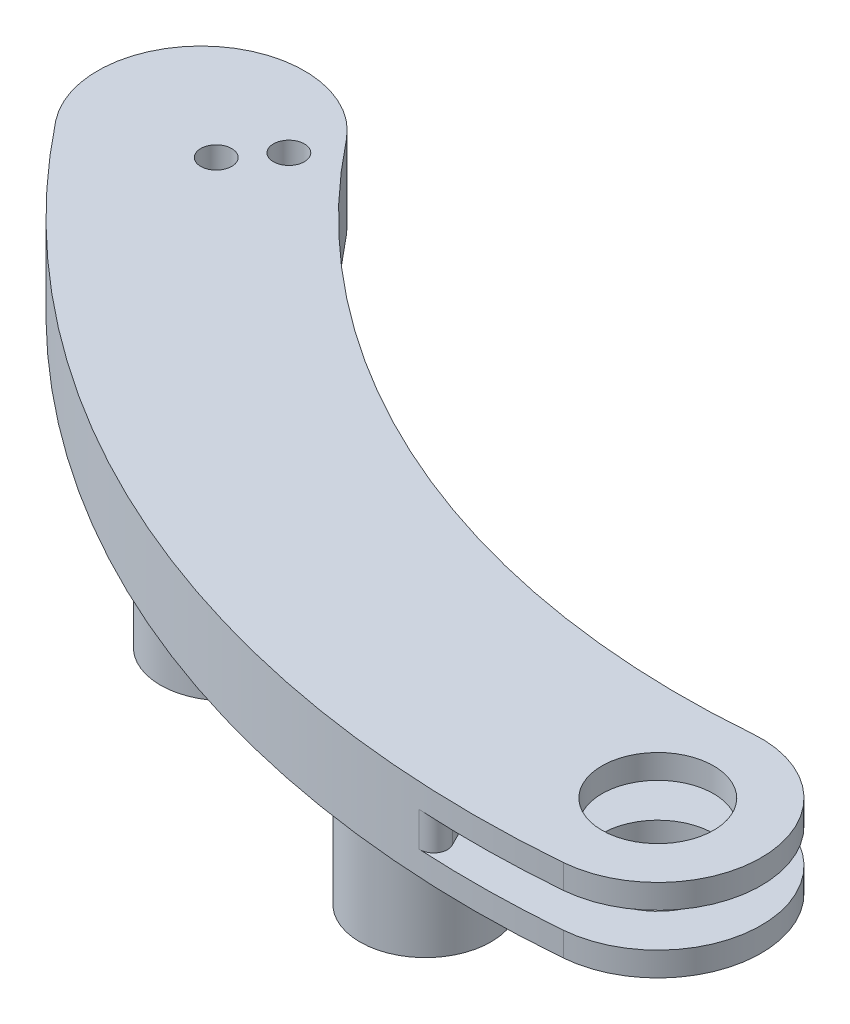
ISO-10303-21;
HEADER;
FILE_DESCRIPTION(('STEP AP214'),'2;1');
FILE_NAME('part.step','',(''),(''),'','','');
FILE_SCHEMA(('AUTOMOTIVE_DESIGN { 1 0 10303 214 1 1 1 1 }'));
ENDSEC;
DATA;
#1=APPLICATION_CONTEXT('core data for automotive mechanical design processes');
#2=APPLICATION_PROTOCOL_DEFINITION('international standard','automotive_design',2000,#1);
#3=PRODUCT_CONTEXT('',#1,'mechanical');
#4=PRODUCT('Part','Part','',(#3));
#5=PRODUCT_RELATED_PRODUCT_CATEGORY('part','',(#4));
#6=PRODUCT_DEFINITION_FORMATION('','',#4);
#7=PRODUCT_DEFINITION_CONTEXT('part definition',#1,'design');
#8=PRODUCT_DEFINITION('design','',#6,#7);
#9=PRODUCT_DEFINITION_SHAPE('','',#8);
#10=(LENGTH_UNIT() NAMED_UNIT(*) SI_UNIT(.MILLI.,.METRE.));
#11=(NAMED_UNIT(*) PLANE_ANGLE_UNIT() SI_UNIT($,.RADIAN.));
#12=(NAMED_UNIT(*) SI_UNIT($,.STERADIAN.) SOLID_ANGLE_UNIT());
#13=UNCERTAINTY_MEASURE_WITH_UNIT(LENGTH_MEASURE(1.E-05),#10,'distance_accuracy_value','');
#14=(GEOMETRIC_REPRESENTATION_CONTEXT(3) GLOBAL_UNCERTAINTY_ASSIGNED_CONTEXT((#13)) GLOBAL_UNIT_ASSIGNED_CONTEXT((#10,
#11,#12)) REPRESENTATION_CONTEXT('',''));
#15=CARTESIAN_POINT('',(0.,0.,0.));
#16=DIRECTION('',(0.,0.,1.));
#17=DIRECTION('',(1.,0.,0.));
#18=AXIS2_PLACEMENT_3D('',#15,#16,#17);
#19=CARTESIAN_POINT('',(-11.1561222970679,12.,-134.5382508259));
#20=DIRECTION('',(0.,-1.,0.));
#21=DIRECTION('',(0.,0.,-1.));
#22=AXIS2_PLACEMENT_3D('',#19,#20,#21);
#23=CYLINDRICAL_SURFACE('',#22,120.);
#24=DIRECTION('',(0.,-1.,0.));
#25=VECTOR('',#24,1.);
#26=CARTESIAN_POINT('',(-23.8009389622773,12.,-15.2063246221251));
#27=LINE('',#26,#25);
#28=CARTESIAN_POINT('',(-23.8009389622773,8.5,-15.2063246221251));
#29=VERTEX_POINT('',#28);
#30=CARTESIAN_POINT('',(-23.8009389622773,3.5,-15.2063246221251));
#31=VERTEX_POINT('',#30);
#32=EDGE_CURVE('E201',#29,#31,#27,.T.);
#33=ORIENTED_EDGE('',*,*,#32,.T.);
#34=CARTESIAN_POINT('',(-11.1561222970679,3.5,-134.5382508259));
#35=DIRECTION('',(0.,1.,0.));
#36=DIRECTION('',(0.,0.,1.));
#37=AXIS2_PLACEMENT_3D('',#34,#35,#36);
#38=CIRCLE('',#37,120.);
#39=CARTESIAN_POINT('',(-1.23956914411867,3.5,-14.9486945362111));
#40=VERTEX_POINT('',#39);
#41=EDGE_CURVE('E151',#31,#40,#38,.T.);
#42=ORIENTED_EDGE('',*,*,#41,.T.);
#43=DIRECTION('',(0.,-1.,0.));
#44=VECTOR('',#43,1.);
#45=CARTESIAN_POINT('',(-1.23956914411867,3.5,-14.9486945362111));
#46=LINE('',#45,#44);
#47=CARTESIAN_POINT('',(-1.23956914411867,0.,-14.9486945362111));
#48=VERTEX_POINT('',#47);
#49=EDGE_CURVE('E138',#40,#48,#46,.T.);
#50=ORIENTED_EDGE('',*,*,#49,.T.);
#51=CARTESIAN_POINT('',(-11.1561222970679,0.,-134.5382508259));
#52=DIRECTION('',(0.,1.,0.));
#53=DIRECTION('',(0.,0.,1.));
#54=AXIS2_PLACEMENT_3D('',#51,#52,#53);
#55=CIRCLE('',#54,120.);
#56=CARTESIAN_POINT('',(-105.239569144119,0.,-60.0513054637889));
#57=VERTEX_POINT('',#56);
#58=EDGE_CURVE('E178',#57,#48,#55,.T.);
#59=ORIENTED_EDGE('',*,*,#58,.F.);
#60=DIRECTION('',(0.,-1.,0.));
#61=VECTOR('',#60,1.);
#62=CARTESIAN_POINT('',(-105.239569144119,12.,-60.0513054637889));
#63=LINE('',#62,#61);
#64=CARTESIAN_POINT('',(-105.239569144119,12.,-60.0513054637889));
#65=VERTEX_POINT('',#64);
#66=EDGE_CURVE('E198',#65,#57,#63,.T.);
#67=ORIENTED_EDGE('',*,*,#66,.F.);
#68=CARTESIAN_POINT('',(-11.1561222970679,12.,-134.5382508259));
#69=DIRECTION('',(0.,1.,0.));
#70=DIRECTION('',(0.,0.,1.));
#71=AXIS2_PLACEMENT_3D('',#68,#69,#70);
#72=CIRCLE('',#71,120.);
#73=CARTESIAN_POINT('',(-1.23956914411867,12.,-14.9486945362111));
#74=VERTEX_POINT('',#73);
#75=EDGE_CURVE('E179',#65,#74,#72,.T.);
#76=ORIENTED_EDGE('',*,*,#75,.T.);
#77=DIRECTION('',(0.,-1.,0.));
#78=VECTOR('',#77,1.);
#79=CARTESIAN_POINT('',(-1.23956914411867,3.5,-14.9486945362111));
#80=LINE('',#79,#78);
#81=CARTESIAN_POINT('',(-1.23956914411867,8.5,-14.9486945362111));
#82=VERTEX_POINT('',#81);
#83=EDGE_CURVE('E170',#74,#82,#80,.T.);
#84=ORIENTED_EDGE('',*,*,#83,.T.);
#85=CARTESIAN_POINT('',(-11.1561222970679,8.5,-134.5382508259));
#86=DIRECTION('',(0.,1.,0.));
#87=DIRECTION('',(0.,0.,1.));
#88=AXIS2_PLACEMENT_3D('',#85,#86,#87);
#89=CIRCLE('',#88,120.);
#90=EDGE_CURVE('E137',#29,#82,#89,.T.);
#91=ORIENTED_EDGE('',*,*,#90,.F.);
#92=EDGE_LOOP('',(#33,#42,#50,#59,#67,#76,#84,#91));
#93=FACE_BOUND('',#92,.T.);
#94=ADVANCED_FACE('F41',(#93),#23,.F.);
#95=CARTESIAN_POINT('',(-11.1561222970679,12.,-134.5382508259));
#96=DIRECTION('',(0.,-1.,0.));
#97=DIRECTION('',(0.,0.,-1.));
#98=AXIS2_PLACEMENT_3D('',#95,#96,#97);
#99=CYLINDRICAL_SURFACE('',#98,150.);
#100=CARTESIAN_POINT('',(-11.1561222970679,3.5,-134.5382508259));
#101=DIRECTION('',(0.,1.,0.));
#102=DIRECTION('',(0.,0.,1.));
#103=AXIS2_PLACEMENT_3D('',#100,#101,#102);
#104=CIRCLE('',#103,150.);
#105=CARTESIAN_POINT('',(-19.3809595649369,3.5,15.2360862679993));
#106=VERTEX_POINT('',#105);
#107=CARTESIAN_POINT('',(1.23956914411865,3.5,14.9486945362112));
#108=VERTEX_POINT('',#107);
#109=EDGE_CURVE('E57',#106,#108,#104,.T.);
#110=ORIENTED_EDGE('',*,*,#109,.F.);
#111=DIRECTION('',(0.,-1.,0.));
#112=VECTOR('',#111,1.);
#113=CARTESIAN_POINT('',(-19.3809595649369,12.,15.2360862679993));
#114=LINE('',#113,#112);
#115=CARTESIAN_POINT('',(-19.3809595649369,8.5,15.2360862679993));
#116=VERTEX_POINT('',#115);
#117=EDGE_CURVE('E224',#106,#116,#114,.F.);
#118=ORIENTED_EDGE('',*,*,#117,.T.);
#119=CARTESIAN_POINT('',(-11.1561222970679,8.5,-134.5382508259));
#120=DIRECTION('',(0.,1.,0.));
#121=DIRECTION('',(0.,0.,1.));
#122=AXIS2_PLACEMENT_3D('',#119,#120,#121);
#123=CIRCLE('',#122,150.);
#124=CARTESIAN_POINT('',(1.23956914411865,8.5,14.9486945362112));
#125=VERTEX_POINT('',#124);
#126=EDGE_CURVE('E65',#116,#125,#123,.T.);
#127=ORIENTED_EDGE('',*,*,#126,.T.);
#128=DIRECTION('',(0.,-1.,0.));
#129=VECTOR('',#128,1.);
#130=CARTESIAN_POINT('',(1.23956914411865,3.5,14.9486945362112));
#131=LINE('',#130,#129);
#132=CARTESIAN_POINT('',(1.23956914411865,12.,14.9486945362112));
#133=VERTEX_POINT('',#132);
#134=EDGE_CURVE('E174',#133,#125,#131,.T.);
#135=ORIENTED_EDGE('',*,*,#134,.F.);
#136=CARTESIAN_POINT('',(-11.1561222970679,12.,-134.5382508259));
#137=DIRECTION('',(0.,1.,0.));
#138=DIRECTION('',(0.,0.,1.));
#139=AXIS2_PLACEMENT_3D('',#136,#137,#138);
#140=CIRCLE('',#139,150.);
#141=CARTESIAN_POINT('',(-128.760430855881,12.,-41.429569123261));
#142=VERTEX_POINT('',#141);
#143=EDGE_CURVE('E185',#142,#133,#140,.T.);
#144=ORIENTED_EDGE('',*,*,#143,.F.);
#145=DIRECTION('',(0.,-1.,0.));
#146=VECTOR('',#145,1.);
#147=CARTESIAN_POINT('',(-128.760430855881,12.,-41.429569123261));
#148=LINE('',#147,#146);
#149=CARTESIAN_POINT('',(-128.760430855881,0.,-41.429569123261));
#150=VERTEX_POINT('',#149);
#151=EDGE_CURVE('E188',#142,#150,#148,.T.);
#152=ORIENTED_EDGE('',*,*,#151,.T.);
#153=CARTESIAN_POINT('',(-11.1561222970679,0.,-134.5382508259));
#154=DIRECTION('',(0.,1.,0.));
#155=DIRECTION('',(0.,0.,1.));
#156=AXIS2_PLACEMENT_3D('',#153,#154,#155);
#157=CIRCLE('',#156,150.);
#158=CARTESIAN_POINT('',(1.23956914411865,0.,14.9486945362112));
#159=VERTEX_POINT('',#158);
#160=EDGE_CURVE('E132',#150,#159,#157,.T.);
#161=ORIENTED_EDGE('',*,*,#160,.T.);
#162=DIRECTION('',(0.,-1.,0.));
#163=VECTOR('',#162,1.);
#164=CARTESIAN_POINT('',(1.23956914411865,3.5,14.9486945362112));
#165=LINE('',#164,#163);
#166=EDGE_CURVE('E128',#108,#159,#165,.T.);
#167=ORIENTED_EDGE('',*,*,#166,.F.);
#168=EDGE_LOOP('',(#110,#118,#127,#135,#144,#152,#161,#167));
#169=FACE_BOUND('',#168,.T.);
#170=ADVANCED_FACE('F129',(#169),#99,.T.);
#171=CARTESIAN_POINT('',(-117.,12.,-50.7404372935249));
#172=DIRECTION('',(0.,-1.,0.));
#173=DIRECTION('',(0.,0.,-1.));
#174=AXIS2_PLACEMENT_3D('',#171,#172,#173);
#175=CYLINDRICAL_SURFACE('',#174,15.);
#176=CARTESIAN_POINT('',(-117.,0.,-50.7404372935249));
#177=DIRECTION('',(0.,1.,0.));
#178=DIRECTION('',(0.,0.,1.));
#179=AXIS2_PLACEMENT_3D('',#176,#177,#178);
#180=CIRCLE('',#179,15.);
#181=EDGE_CURVE('E191',#57,#150,#180,.T.);
#182=ORIENTED_EDGE('',*,*,#181,.T.);
#183=ORIENTED_EDGE('',*,*,#151,.F.);
#184=CARTESIAN_POINT('',(-117.,12.,-50.7404372935249));
#185=DIRECTION('',(0.,1.,0.));
#186=DIRECTION('',(0.,0.,1.));
#187=AXIS2_PLACEMENT_3D('',#184,#185,#186);
#188=CIRCLE('',#187,15.);
#189=EDGE_CURVE('E182',#65,#142,#188,.T.);
#190=ORIENTED_EDGE('',*,*,#189,.F.);
#191=ORIENTED_EDGE('',*,*,#66,.T.);
#192=EDGE_LOOP('',(#182,#183,#190,#191));
#193=FACE_BOUND('',#192,.T.);
#194=ADVANCED_FACE('F268',(#193),#175,.T.);
#195=CARTESIAN_POINT('',(0.,12.,0.));
#196=DIRECTION('',(0.,1.,0.));
#197=DIRECTION('',(0.,0.,1.));
#198=AXIS2_PLACEMENT_3D('',#195,#196,#197);
#199=PLANE('',#198);
#200=CARTESIAN_POINT('',(-107.816607253969,12.,-54.3024904049805));
#201=DIRECTION('',(0.,1.,0.));
#202=DIRECTION('',(0.,0.,1.));
#203=AXIS2_PLACEMENT_3D('',#200,#201,#202);
#204=CIRCLE('',#203,2.25);
#205=CARTESIAN_POINT('',(-107.816607253969,12.,-52.0524904049805));
#206=VERTEX_POINT('',#205);
#207=EDGE_CURVE('E331',#206,#206,#204,.T.);
#208=ORIENTED_EDGE('',*,*,#207,.F.);
#209=EDGE_LOOP('',(#208));
#210=FACE_BOUND('',#209,.T.);
#211=CARTESIAN_POINT('',(-112.49908312254,12.,-48.4437857921633));
#212=DIRECTION('',(0.,1.,0.));
#213=DIRECTION('',(0.,0.,1.));
#214=AXIS2_PLACEMENT_3D('',#211,#212,#213);
#215=CIRCLE('',#214,2.25);
#216=CARTESIAN_POINT('',(-112.49908312254,12.,-46.1937857921633));
#217=VERTEX_POINT('',#216);
#218=EDGE_CURVE('E322',#217,#217,#215,.T.);
#219=ORIENTED_EDGE('',*,*,#218,.F.);
#220=EDGE_LOOP('',(#219));
#221=FACE_BOUND('',#220,.T.);
#222=CARTESIAN_POINT('',(0.,12.,0.));
#223=DIRECTION('',(0.,1.,0.));
#224=DIRECTION('',(0.,0.,1.));
#225=AXIS2_PLACEMENT_3D('',#222,#223,#224);
#226=CIRCLE('',#225,8.1);
#227=CARTESIAN_POINT('',(0.,12.,8.1));
#228=VERTEX_POINT('',#227);
#229=EDGE_CURVE('E314',#228,#228,#226,.T.);
#230=ORIENTED_EDGE('',*,*,#229,.F.);
#231=EDGE_LOOP('',(#230));
#232=FACE_BOUND('',#231,.T.);
#233=ORIENTED_EDGE('',*,*,#143,.T.);
#234=CARTESIAN_POINT('',(0.,12.,0.));
#235=DIRECTION('',(0.,1.,0.));
#236=DIRECTION('',(0.,0.,1.));
#237=AXIS2_PLACEMENT_3D('',#234,#235,#236);
#238=CIRCLE('',#237,15.);
#239=EDGE_CURVE('E166',#133,#74,#238,.T.);
#240=ORIENTED_EDGE('',*,*,#239,.T.);
#241=ORIENTED_EDGE('',*,*,#75,.F.);
#242=ORIENTED_EDGE('',*,*,#189,.T.);
#243=EDGE_LOOP('',(#233,#240,#241,#242));
#244=FACE_BOUND('',#243,.T.);
#245=ADVANCED_FACE('F257',(#210,#221,#232,#244),#199,.T.);
#246=CARTESIAN_POINT('',(0.,0.,0.));
#247=DIRECTION('',(0.,1.,0.));
#248=DIRECTION('',(0.,0.,1.));
#249=AXIS2_PLACEMENT_3D('',#246,#247,#248);
#250=PLANE('',#249);
#251=CARTESIAN_POINT('',(-82.2471679808014,0.,-19.6042898686989));
#252=DIRECTION('',(0.,1.,0.));
#253=DIRECTION('',(0.,0.,1.));
#254=AXIS2_PLACEMENT_3D('',#251,#252,#253);
#255=CIRCLE('',#254,9.49999999999999);
#256=CARTESIAN_POINT('',(-82.2471679808014,0.,-10.1042898686989));
#257=VERTEX_POINT('',#256);
#258=EDGE_CURVE('E350',#257,#257,#255,.T.);
#259=ORIENTED_EDGE('',*,*,#258,.T.);
#260=EDGE_LOOP('',(#259));
#261=FACE_BOUND('',#260,.T.);
#262=CARTESIAN_POINT('',(-35.5199347805148,0.,-1.81199722705093));
#263=DIRECTION('',(0.,1.,0.));
#264=DIRECTION('',(0.,0.,1.));
#265=AXIS2_PLACEMENT_3D('',#262,#263,#264);
#266=CIRCLE('',#265,9.5);
#267=CARTESIAN_POINT('',(-35.5199347805148,0.,7.68800277294907));
#268=VERTEX_POINT('',#267);
#269=EDGE_CURVE('E338',#268,#268,#266,.T.);
#270=ORIENTED_EDGE('',*,*,#269,.T.);
#271=EDGE_LOOP('',(#270));
#272=FACE_BOUND('',#271,.T.);
#273=CARTESIAN_POINT('',(-107.816607253969,0.,-54.3024904049805));
#274=DIRECTION('',(0.,1.,0.));
#275=DIRECTION('',(0.,0.,1.));
#276=AXIS2_PLACEMENT_3D('',#273,#274,#275);
#277=CIRCLE('',#276,2.25);
#278=CARTESIAN_POINT('',(-107.816607253969,0.,-52.0524904049805));
#279=VERTEX_POINT('',#278);
#280=EDGE_CURVE('E318',#279,#279,#277,.T.);
#281=ORIENTED_EDGE('',*,*,#280,.T.);
#282=EDGE_LOOP('',(#281));
#283=FACE_BOUND('',#282,.T.);
#284=CARTESIAN_POINT('',(-112.49908312254,0.,-48.4437857921633));
#285=DIRECTION('',(0.,1.,0.));
#286=DIRECTION('',(0.,0.,1.));
#287=AXIS2_PLACEMENT_3D('',#284,#285,#286);
#288=CIRCLE('',#287,2.25);
#289=CARTESIAN_POINT('',(-112.49908312254,0.,-46.1937857921633));
#290=VERTEX_POINT('',#289);
#291=EDGE_CURVE('E326',#290,#290,#288,.T.);
#292=ORIENTED_EDGE('',*,*,#291,.T.);
#293=EDGE_LOOP('',(#292));
#294=FACE_BOUND('',#293,.T.);
#295=CARTESIAN_POINT('',(0.,0.,0.));
#296=DIRECTION('',(0.,1.,0.));
#297=DIRECTION('',(0.,0.,1.));
#298=AXIS2_PLACEMENT_3D('',#295,#296,#297);
#299=CIRCLE('',#298,8.1);
#300=CARTESIAN_POINT('',(0.,0.,8.1));
#301=VERTEX_POINT('',#300);
#302=EDGE_CURVE('E206',#301,#301,#299,.T.);
#303=ORIENTED_EDGE('',*,*,#302,.T.);
#304=EDGE_LOOP('',(#303));
#305=FACE_BOUND('',#304,.T.);
#306=ORIENTED_EDGE('',*,*,#58,.T.);
#307=CARTESIAN_POINT('',(0.,0.,0.));
#308=DIRECTION('',(0.,1.,0.));
#309=DIRECTION('',(0.,0.,1.));
#310=AXIS2_PLACEMENT_3D('',#307,#308,#309);
#311=CIRCLE('',#310,15.);
#312=EDGE_CURVE('E149',#159,#48,#311,.T.);
#313=ORIENTED_EDGE('',*,*,#312,.F.);
#314=ORIENTED_EDGE('',*,*,#160,.F.);
#315=ORIENTED_EDGE('',*,*,#181,.F.);
#316=EDGE_LOOP('',(#306,#313,#314,#315));
#317=FACE_BOUND('',#316,.T.);
#318=ADVANCED_FACE('F241',(#261,#272,#283,#294,#305,#317),#250,.F.);
#319=CARTESIAN_POINT('',(0.,3.5,0.));
#320=DIRECTION('',(0.,-1.,0.));
#321=DIRECTION('',(0.,0.,-1.));
#322=AXIS2_PLACEMENT_3D('',#319,#320,#321);
#323=CYLINDRICAL_SURFACE('',#322,15.);
#324=ORIENTED_EDGE('',*,*,#134,.T.);
#325=CARTESIAN_POINT('',(0.,8.5,0.));
#326=DIRECTION('',(0.,1.,0.));
#327=DIRECTION('',(0.,0.,1.));
#328=AXIS2_PLACEMENT_3D('',#325,#326,#327);
#329=CIRCLE('',#328,15.);
#330=EDGE_CURVE('E162',#125,#82,#329,.T.);
#331=ORIENTED_EDGE('',*,*,#330,.T.);
#332=ORIENTED_EDGE('',*,*,#83,.F.);
#333=ORIENTED_EDGE('',*,*,#239,.F.);
#334=EDGE_LOOP('',(#324,#331,#332,#333));
#335=FACE_BOUND('',#334,.T.);
#336=ADVANCED_FACE('F256',(#335),#323,.T.);
#337=CARTESIAN_POINT('',(4.94575057272327,8.5,-0.508204869290588));
#338=DIRECTION('',(0.,-1.,0.));
#339=DIRECTION('',(0.,0.,-1.));
#340=AXIS2_PLACEMENT_3D('',#337,#338,#339);
#341=CYLINDRICAL_SURFACE('',#340,25.8469667324395);
#342=CARTESIAN_POINT('',(4.94575057272327,8.5,-0.508204869290588));
#343=DIRECTION('',(0.,1.,0.));
#344=DIRECTION('',(0.,0.,1.));
#345=AXIS2_PLACEMENT_3D('',#342,#343,#344);
#346=CIRCLE('',#345,25.8469667324395);
#347=CARTESIAN_POINT('',(-19.5828410970926,8.5,-8.65767601552298));
#348=VERTEX_POINT('',#347);
#349=CARTESIAN_POINT('',(-17.5320000221163,8.5,12.2517487930087));
#350=VERTEX_POINT('',#349);
#351=EDGE_CURVE('E156',#348,#350,#346,.T.);
#352=ORIENTED_EDGE('',*,*,#351,.T.);
#353=DIRECTION('',(0.,-1.,0.));
#354=VECTOR('',#353,1.);
#355=CARTESIAN_POINT('',(-17.5320000221163,8.5,12.2517487930087));
#356=LINE('',#355,#354);
#357=CARTESIAN_POINT('',(-17.5320000221163,3.5,12.2517487930087));
#358=VERTEX_POINT('',#357);
#359=EDGE_CURVE('E220',#350,#358,#356,.T.);
#360=ORIENTED_EDGE('',*,*,#359,.T.);
#361=CARTESIAN_POINT('',(4.94575057272327,3.5,-0.508204869290588));
#362=DIRECTION('',(0.,1.,0.));
#363=DIRECTION('',(0.,0.,1.));
#364=AXIS2_PLACEMENT_3D('',#361,#362,#363);
#365=CIRCLE('',#364,25.8469667324395);
#366=CARTESIAN_POINT('',(-19.5828410970926,3.5,-8.65767601552298));
#367=VERTEX_POINT('',#366);
#368=EDGE_CURVE('E125',#367,#358,#365,.T.);
#369=ORIENTED_EDGE('',*,*,#368,.F.);
#370=DIRECTION('',(0.,-1.,0.));
#371=VECTOR('',#370,1.);
#372=CARTESIAN_POINT('',(-19.5828410970926,8.5,-8.65767601552298));
#373=LINE('',#372,#371);
#374=EDGE_CURVE('E210',#367,#348,#373,.F.);
#375=ORIENTED_EDGE('',*,*,#374,.T.);
#376=EDGE_LOOP('',(#352,#360,#369,#375));
#377=FACE_BOUND('',#376,.T.);
#378=ADVANCED_FACE('F292',(#377),#341,.F.);
#379=CARTESIAN_POINT('',(0.,8.5,0.));
#380=DIRECTION('',(0.,1.,0.));
#381=DIRECTION('',(0.,0.,1.));
#382=AXIS2_PLACEMENT_3D('',#379,#380,#381);
#383=PLANE('',#382);
#384=CARTESIAN_POINT('',(0.,8.5,0.));
#385=DIRECTION('',(0.,1.,0.));
#386=DIRECTION('',(0.,0.,1.));
#387=AXIS2_PLACEMENT_3D('',#384,#385,#386);
#388=CIRCLE('',#387,8.1);
#389=CARTESIAN_POINT('',(0.,8.5,8.1));
#390=VERTEX_POINT('',#389);
#391=EDGE_CURVE('E152',#390,#390,#388,.T.);
#392=ORIENTED_EDGE('',*,*,#391,.T.);
#393=EDGE_LOOP('',(#392));
#394=FACE_BOUND('',#393,.T.);
#395=ORIENTED_EDGE('',*,*,#90,.T.);
#396=ORIENTED_EDGE('',*,*,#330,.F.);
#397=ORIENTED_EDGE('',*,*,#126,.F.);
#398=CARTESIAN_POINT('',(-19.271295068032,8.5,13.2390951067473));
#399=DIRECTION('',(0.,1.,0.));
#400=DIRECTION('',(0.,0.,1.));
#401=AXIS2_PLACEMENT_3D('',#398,#399,#400);
#402=CIRCLE('',#401,2.);
#403=EDGE_CURVE('E229',#116,#350,#402,.T.);
#404=ORIENTED_EDGE('',*,*,#403,.T.);
#405=ORIENTED_EDGE('',*,*,#351,.F.);
#406=CARTESIAN_POINT('',(-24.3278063233277,8.5,-10.2341610303012));
#407=DIRECTION('',(0.,1.,0.));
#408=DIRECTION('',(0.,0.,1.));
#409=AXIS2_PLACEMENT_3D('',#406,#407,#408);
#410=CIRCLE('',#409,5.);
#411=EDGE_CURVE('E216',#348,#29,#410,.T.);
#412=ORIENTED_EDGE('',*,*,#411,.T.);
#413=EDGE_LOOP('',(#395,#396,#397,#404,#405,#412));
#414=FACE_BOUND('',#413,.T.);
#415=ADVANCED_FACE('F288',(#394,#414),#383,.F.);
#416=CARTESIAN_POINT('',(0.,3.5,0.));
#417=DIRECTION('',(0.,-1.,0.));
#418=DIRECTION('',(0.,0.,-1.));
#419=AXIS2_PLACEMENT_3D('',#416,#417,#418);
#420=CYLINDRICAL_SURFACE('',#419,15.);
#421=ORIENTED_EDGE('',*,*,#312,.T.);
#422=ORIENTED_EDGE('',*,*,#49,.F.);
#423=CARTESIAN_POINT('',(0.,3.5,0.));
#424=DIRECTION('',(0.,1.,0.));
#425=DIRECTION('',(0.,0.,1.));
#426=AXIS2_PLACEMENT_3D('',#423,#424,#425);
#427=CIRCLE('',#426,15.);
#428=EDGE_CURVE('E119',#108,#40,#427,.T.);
#429=ORIENTED_EDGE('',*,*,#428,.F.);
#430=ORIENTED_EDGE('',*,*,#166,.T.);
#431=EDGE_LOOP('',(#421,#422,#429,#430));
#432=FACE_BOUND('',#431,.T.);
#433=ADVANCED_FACE('F140',(#432),#420,.T.);
#434=CARTESIAN_POINT('',(0.,3.5,0.));
#435=DIRECTION('',(0.,1.,0.));
#436=DIRECTION('',(0.,0.,1.));
#437=AXIS2_PLACEMENT_3D('',#434,#435,#436);
#438=PLANE('',#437);
#439=CARTESIAN_POINT('',(0.,3.5,0.));
#440=DIRECTION('',(0.,1.,0.));
#441=DIRECTION('',(0.,0.,1.));
#442=AXIS2_PLACEMENT_3D('',#439,#440,#441);
#443=CIRCLE('',#442,8.1);
#444=CARTESIAN_POINT('',(0.,3.5,8.1));
#445=VERTEX_POINT('',#444);
#446=EDGE_CURVE('E202',#445,#445,#443,.T.);
#447=ORIENTED_EDGE('',*,*,#446,.F.);
#448=EDGE_LOOP('',(#447));
#449=FACE_BOUND('',#448,.T.);
#450=ORIENTED_EDGE('',*,*,#41,.F.);
#451=CARTESIAN_POINT('',(-24.3278063233277,3.5,-10.2341610303012));
#452=DIRECTION('',(0.,1.,0.));
#453=DIRECTION('',(0.,0.,1.));
#454=AXIS2_PLACEMENT_3D('',#451,#452,#453);
#455=CIRCLE('',#454,5.);
#456=EDGE_CURVE('E213',#31,#367,#455,.F.);
#457=ORIENTED_EDGE('',*,*,#456,.T.);
#458=ORIENTED_EDGE('',*,*,#368,.T.);
#459=CARTESIAN_POINT('',(-19.271295068032,3.5,13.2390951067473));
#460=DIRECTION('',(0.,1.,0.));
#461=DIRECTION('',(0.,0.,1.));
#462=AXIS2_PLACEMENT_3D('',#459,#460,#461);
#463=CIRCLE('',#462,2.);
#464=EDGE_CURVE('E122',#358,#106,#463,.F.);
#465=ORIENTED_EDGE('',*,*,#464,.T.);
#466=ORIENTED_EDGE('',*,*,#109,.T.);
#467=ORIENTED_EDGE('',*,*,#428,.T.);
#468=EDGE_LOOP('',(#450,#457,#458,#465,#466,#467));
#469=FACE_BOUND('',#468,.T.);
#470=ADVANCED_FACE('F117',(#449,#469),#438,.T.);
#471=CARTESIAN_POINT('',(0.,0.,0.));
#472=DIRECTION('',(0.,1.,0.));
#473=DIRECTION('',(0.,0.,1.));
#474=AXIS2_PLACEMENT_3D('',#471,#472,#473);
#475=CYLINDRICAL_SURFACE('',#474,8.1);
#476=ORIENTED_EDGE('',*,*,#446,.T.);
#477=EDGE_LOOP('',(#476));
#478=FACE_BOUND('',#477,.T.);
#479=ORIENTED_EDGE('',*,*,#302,.F.);
#480=EDGE_LOOP('',(#479));
#481=FACE_BOUND('',#480,.T.);
#482=ADVANCED_FACE('F280',(#478,#481),#475,.F.);
#483=ORIENTED_EDGE('',*,*,#229,.T.);
#484=EDGE_LOOP('',(#483));
#485=FACE_BOUND('',#484,.T.);
#486=ORIENTED_EDGE('',*,*,#391,.F.);
#487=EDGE_LOOP('',(#486));
#488=FACE_BOUND('',#487,.T.);
#489=ADVANCED_FACE('F272',(#485,#488),#475,.F.);
#490=CARTESIAN_POINT('',(-24.3278063233277,8.5,-10.2341610303012));
#491=DIRECTION('',(0.,-1.,0.));
#492=DIRECTION('',(0.,0.,-1.));
#493=AXIS2_PLACEMENT_3D('',#490,#491,#492);
#494=CYLINDRICAL_SURFACE('',#493,5.);
#495=ORIENTED_EDGE('',*,*,#411,.F.);
#496=ORIENTED_EDGE('',*,*,#374,.F.);
#497=ORIENTED_EDGE('',*,*,#456,.F.);
#498=ORIENTED_EDGE('',*,*,#32,.F.);
#499=EDGE_LOOP('',(#495,#496,#497,#498));
#500=FACE_BOUND('',#499,.T.);
#501=ADVANCED_FACE('F270',(#500),#494,.T.);
#502=CARTESIAN_POINT('',(-19.271295068032,12.,13.2390951067473));
#503=DIRECTION('',(0.,1.,0.));
#504=DIRECTION('',(0.,0.,1.));
#505=AXIS2_PLACEMENT_3D('',#502,#503,#504);
#506=CYLINDRICAL_SURFACE('',#505,2.);
#507=ORIENTED_EDGE('',*,*,#403,.F.);
#508=ORIENTED_EDGE('',*,*,#117,.F.);
#509=ORIENTED_EDGE('',*,*,#464,.F.);
#510=ORIENTED_EDGE('',*,*,#359,.F.);
#511=EDGE_LOOP('',(#507,#508,#509,#510));
#512=FACE_BOUND('',#511,.T.);
#513=ADVANCED_FACE('F43',(#512),#506,.T.);
#514=CARTESIAN_POINT('',(-112.49908312254,0.,-48.4437857921633));
#515=DIRECTION('',(0.,1.,0.));
#516=DIRECTION('',(0.,0.,1.));
#517=AXIS2_PLACEMENT_3D('',#514,#515,#516);
#518=CYLINDRICAL_SURFACE('',#517,2.25);
#519=ORIENTED_EDGE('',*,*,#291,.F.);
#520=EDGE_LOOP('',(#519));
#521=FACE_BOUND('',#520,.T.);
#522=ORIENTED_EDGE('',*,*,#218,.T.);
#523=EDGE_LOOP('',(#522));
#524=FACE_BOUND('',#523,.T.);
#525=ADVANCED_FACE('F278',(#521,#524),#518,.F.);
#526=CARTESIAN_POINT('',(-107.816607253969,0.,-54.3024904049805));
#527=DIRECTION('',(0.,1.,0.));
#528=DIRECTION('',(0.,0.,1.));
#529=AXIS2_PLACEMENT_3D('',#526,#527,#528);
#530=CYLINDRICAL_SURFACE('',#529,2.25);
#531=ORIENTED_EDGE('',*,*,#280,.F.);
#532=EDGE_LOOP('',(#531));
#533=FACE_BOUND('',#532,.T.);
#534=ORIENTED_EDGE('',*,*,#207,.T.);
#535=EDGE_LOOP('',(#534));
#536=FACE_BOUND('',#535,.T.);
#537=ADVANCED_FACE('F379',(#533,#536),#530,.F.);
#538=CARTESIAN_POINT('',(-35.5199347805148,-20.,-1.81199722705093));
#539=DIRECTION('',(0.,1.,0.));
#540=DIRECTION('',(0.,0.,1.));
#541=AXIS2_PLACEMENT_3D('',#538,#539,#540);
#542=CYLINDRICAL_SURFACE('',#541,9.5);
#543=CARTESIAN_POINT('',(-35.5199347805148,-20.,-1.81199722705093));
#544=DIRECTION('',(0.,1.,0.));
#545=DIRECTION('',(0.,0.,1.));
#546=AXIS2_PLACEMENT_3D('',#543,#544,#545);
#547=CIRCLE('',#546,9.5);
#548=CARTESIAN_POINT('',(-35.5199347805148,-20.,7.68800277294907));
#549=VERTEX_POINT('',#548);
#550=EDGE_CURVE('E327',#549,#549,#547,.T.);
#551=ORIENTED_EDGE('',*,*,#550,.T.);
#552=EDGE_LOOP('',(#551));
#553=FACE_BOUND('',#552,.T.);
#554=ORIENTED_EDGE('',*,*,#269,.F.);
#555=EDGE_LOOP('',(#554));
#556=FACE_BOUND('',#555,.T.);
#557=ADVANCED_FACE('F375',(#553,#556),#542,.T.);
#558=CARTESIAN_POINT('',(-35.5199347805148,-20.,-1.81199722705093));
#559=DIRECTION('',(0.,1.,0.));
#560=DIRECTION('',(0.,0.,1.));
#561=AXIS2_PLACEMENT_3D('',#558,#559,#560);
#562=PLANE('',#561);
#563=CARTESIAN_POINT('',(-35.5199347805148,-20.,-1.81199722705093));
#564=DIRECTION('',(0.,1.,0.));
#565=DIRECTION('',(0.,0.,1.));
#566=AXIS2_PLACEMENT_3D('',#563,#564,#565);
#567=CIRCLE('',#566,8.1);
#568=CARTESIAN_POINT('',(-35.5199347805148,-20.,6.28800277294907));
#569=VERTEX_POINT('',#568);
#570=EDGE_CURVE('E342',#569,#569,#567,.T.);
#571=ORIENTED_EDGE('',*,*,#570,.T.);
#572=EDGE_LOOP('',(#571));
#573=FACE_BOUND('',#572,.T.);
#574=ORIENTED_EDGE('',*,*,#550,.F.);
#575=EDGE_LOOP('',(#574));
#576=FACE_BOUND('',#575,.T.);
#577=ADVANCED_FACE('F250',(#573,#576),#562,.F.);
#578=CARTESIAN_POINT('',(-35.5199347805148,-20.,-1.81199722705093));
#579=DIRECTION('',(0.,1.,0.));
#580=DIRECTION('',(0.,0.,1.));
#581=AXIS2_PLACEMENT_3D('',#578,#579,#580);
#582=CYLINDRICAL_SURFACE('',#581,8.1);
#583=ORIENTED_EDGE('',*,*,#570,.F.);
#584=EDGE_LOOP('',(#583));
#585=FACE_BOUND('',#584,.T.);
#586=CARTESIAN_POINT('',(-35.5199347805148,0.,-1.81199722705093));
#587=DIRECTION('',(0.,1.,0.));
#588=DIRECTION('',(0.,0.,1.));
#589=AXIS2_PLACEMENT_3D('',#586,#587,#588);
#590=CIRCLE('',#589,8.1);
#591=CARTESIAN_POINT('',(-35.5199347805148,0.,6.28800277294907));
#592=VERTEX_POINT('',#591);
#593=EDGE_CURVE('E50',#592,#592,#590,.T.);
#594=ORIENTED_EDGE('',*,*,#593,.T.);
#595=EDGE_LOOP('',(#594));
#596=FACE_BOUND('',#595,.T.);
#597=ADVANCED_FACE('F235',(#585,#596),#582,.F.);
#598=ORIENTED_EDGE('',*,*,#593,.F.);
#599=EDGE_LOOP('',(#598));
#600=FACE_BOUND('',#599,.T.);
#601=ADVANCED_FACE('F237',(#600),#250,.F.);
#602=CARTESIAN_POINT('',(-82.2471679808014,-20.,-19.6042898686989));
#603=DIRECTION('',(0.,1.,0.));
#604=DIRECTION('',(0.,0.,1.));
#605=AXIS2_PLACEMENT_3D('',#602,#603,#604);
#606=CYLINDRICAL_SURFACE('',#605,9.49999999999999);
#607=CARTESIAN_POINT('',(-82.2471679808014,-20.,-19.6042898686989));
#608=DIRECTION('',(0.,1.,0.));
#609=DIRECTION('',(0.,0.,1.));
#610=AXIS2_PLACEMENT_3D('',#607,#608,#609);
#611=CIRCLE('',#610,9.49999999999999);
#612=CARTESIAN_POINT('',(-82.2471679808014,-20.,-10.1042898686989));
#613=VERTEX_POINT('',#612);
#614=EDGE_CURVE('E349',#613,#613,#611,.T.);
#615=ORIENTED_EDGE('',*,*,#614,.T.);
#616=EDGE_LOOP('',(#615));
#617=FACE_BOUND('',#616,.T.);
#618=ORIENTED_EDGE('',*,*,#258,.F.);
#619=EDGE_LOOP('',(#618));
#620=FACE_BOUND('',#619,.T.);
#621=ADVANCED_FACE('F239',(#617,#620),#606,.T.);
#622=CARTESIAN_POINT('',(-82.2471679808014,-20.,-19.6042898686989));
#623=DIRECTION('',(0.,1.,0.));
#624=DIRECTION('',(0.,0.,1.));
#625=AXIS2_PLACEMENT_3D('',#622,#623,#624);
#626=PLANE('',#625);
#627=CARTESIAN_POINT('',(-82.2471679808014,-20.,-19.6042898686989));
#628=DIRECTION('',(0.,1.,0.));
#629=DIRECTION('',(0.,0.,1.));
#630=AXIS2_PLACEMENT_3D('',#627,#628,#629);
#631=CIRCLE('',#630,8.09999999999999);
#632=CARTESIAN_POINT('',(-82.2471679808014,-20.,-11.5042898686989));
#633=VERTEX_POINT('',#632);
#634=EDGE_CURVE('E354',#633,#633,#631,.T.);
#635=ORIENTED_EDGE('',*,*,#634,.T.);
#636=EDGE_LOOP('',(#635));
#637=FACE_BOUND('',#636,.T.);
#638=ORIENTED_EDGE('',*,*,#614,.F.);
#639=EDGE_LOOP('',(#638));
#640=FACE_BOUND('',#639,.T.);
#641=ADVANCED_FACE('F247',(#637,#640),#626,.F.);
#642=CARTESIAN_POINT('',(-82.2471679808014,-20.,-19.6042898686989));
#643=DIRECTION('',(0.,1.,0.));
#644=DIRECTION('',(0.,0.,1.));
#645=AXIS2_PLACEMENT_3D('',#642,#643,#644);
#646=CYLINDRICAL_SURFACE('',#645,8.09999999999999);
#647=ORIENTED_EDGE('',*,*,#634,.F.);
#648=EDGE_LOOP('',(#647));
#649=FACE_BOUND('',#648,.T.);
#650=CARTESIAN_POINT('',(-82.2471679808014,0.,-19.6042898686989));
#651=DIRECTION('',(0.,1.,0.));
#652=DIRECTION('',(0.,0.,1.));
#653=AXIS2_PLACEMENT_3D('',#650,#651,#652);
#654=CIRCLE('',#653,8.09999999999999);
#655=CARTESIAN_POINT('',(-82.2471679808014,0.,-11.5042898686989));
#656=VERTEX_POINT('',#655);
#657=EDGE_CURVE('E11',#656,#656,#654,.T.);
#658=ORIENTED_EDGE('',*,*,#657,.T.);
#659=EDGE_LOOP('',(#658));
#660=FACE_BOUND('',#659,.T.);
#661=ADVANCED_FACE('F260',(#649,#660),#646,.F.);
#662=ORIENTED_EDGE('',*,*,#657,.F.);
#663=EDGE_LOOP('',(#662));
#664=FACE_BOUND('',#663,.T.);
#665=ADVANCED_FACE('F242',(#664),#250,.F.);
#666=CLOSED_SHELL('',(#94,#170,#194,#245,#318,#336,#378,#415,#433,#470,#482,#489,#501,#513,#525,
#537,#557,#577,#597,#601,#621,#641,#661,#665));
#667=MANIFOLD_SOLID_BREP('B2',#666);
#668=ADVANCED_BREP_SHAPE_REPRESENTATION('',(#18,#667),#14);
#669=SHAPE_DEFINITION_REPRESENTATION(#9,#668);
ENDSEC;
END-ISO-10303-21;
